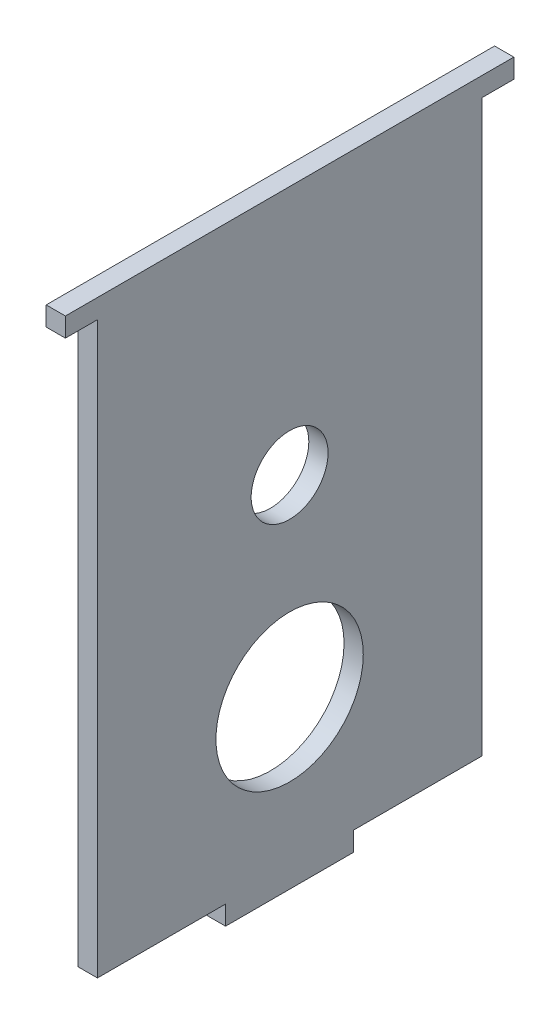
ISO-10303-21;
HEADER;
FILE_DESCRIPTION(('STEP AP214'),'2;1');
FILE_NAME('part.step','',(''),(''),'','','');
FILE_SCHEMA(('AUTOMOTIVE_DESIGN { 1 0 10303 214 1 1 1 1 }'));
ENDSEC;
DATA;
#1=APPLICATION_CONTEXT('core data for automotive mechanical design processes');
#2=APPLICATION_PROTOCOL_DEFINITION('international standard','automotive_design',2000,#1);
#3=PRODUCT_CONTEXT('',#1,'mechanical');
#4=PRODUCT('Part','Part','',(#3));
#5=PRODUCT_RELATED_PRODUCT_CATEGORY('part','',(#4));
#6=PRODUCT_DEFINITION_FORMATION('','',#4);
#7=PRODUCT_DEFINITION_CONTEXT('part definition',#1,'design');
#8=PRODUCT_DEFINITION('design','',#6,#7);
#9=PRODUCT_DEFINITION_SHAPE('','',#8);
#10=(LENGTH_UNIT() NAMED_UNIT(*) SI_UNIT(.MILLI.,.METRE.));
#11=(NAMED_UNIT(*) PLANE_ANGLE_UNIT() SI_UNIT($,.RADIAN.));
#12=(NAMED_UNIT(*) SI_UNIT($,.STERADIAN.) SOLID_ANGLE_UNIT());
#13=UNCERTAINTY_MEASURE_WITH_UNIT(LENGTH_MEASURE(1.E-05),#10,'distance_accuracy_value','');
#14=(GEOMETRIC_REPRESENTATION_CONTEXT(3) GLOBAL_UNCERTAINTY_ASSIGNED_CONTEXT((#13)) GLOBAL_UNIT_ASSIGNED_CONTEXT((#10,
#11,#12)) REPRESENTATION_CONTEXT('',''));
#15=CARTESIAN_POINT('',(0.,0.,0.));
#16=DIRECTION('',(0.,0.,1.));
#17=DIRECTION('',(1.,0.,0.));
#18=AXIS2_PLACEMENT_3D('',#15,#16,#17);
#19=CARTESIAN_POINT('',(3.,-48.,30.));
#20=DIRECTION('',(0.,1.,0.));
#21=DIRECTION('',(0.,0.,1.));
#22=AXIS2_PLACEMENT_3D('',#19,#20,#21);
#23=PLANE('',#22);
#24=DIRECTION('',(-1.,0.,0.));
#25=VECTOR('',#24,1.);
#26=CARTESIAN_POINT('',(3.,-48.,10.));
#27=LINE('',#26,#25);
#28=CARTESIAN_POINT('',(3.,-48.,10.));
#29=VERTEX_POINT('',#28);
#30=CARTESIAN_POINT('',(0.,-48.,10.));
#31=VERTEX_POINT('',#30);
#32=EDGE_CURVE('E136',#29,#31,#27,.T.);
#33=ORIENTED_EDGE('',*,*,#32,.F.);
#34=DIRECTION('',(0.,0.,-1.));
#35=VECTOR('',#34,1.);
#36=CARTESIAN_POINT('',(3.,-48.,30.));
#37=LINE('',#36,#35);
#38=CARTESIAN_POINT('',(3.,-48.,30.));
#39=VERTEX_POINT('',#38);
#40=EDGE_CURVE('E148',#39,#29,#37,.T.);
#41=ORIENTED_EDGE('',*,*,#40,.F.);
#42=DIRECTION('',(-1.,0.,0.));
#43=VECTOR('',#42,1.);
#44=CARTESIAN_POINT('',(3.,-48.,30.));
#45=LINE('',#44,#43);
#46=CARTESIAN_POINT('',(0.,-48.,30.));
#47=VERTEX_POINT('',#46);
#48=EDGE_CURVE('E11',#39,#47,#45,.T.);
#49=ORIENTED_EDGE('',*,*,#48,.T.);
#50=DIRECTION('',(0.,0.,-1.));
#51=VECTOR('',#50,1.);
#52=CARTESIAN_POINT('',(0.,-48.,30.));
#53=LINE('',#52,#51);
#54=EDGE_CURVE('E150',#47,#31,#53,.T.);
#55=ORIENTED_EDGE('',*,*,#54,.T.);
#56=EDGE_LOOP('',(#33,#41,#49,#55));
#57=FACE_BOUND('',#56,.T.);
#58=ADVANCED_FACE('F39',(#57),#23,.F.);
#59=CARTESIAN_POINT('',(3.,48.,-30.));
#60=DIRECTION('',(0.,0.,1.));
#61=DIRECTION('',(0.,-1.,0.));
#62=AXIS2_PLACEMENT_3D('',#59,#60,#61);
#63=PLANE('',#62);
#64=DIRECTION('',(-1.,0.,0.));
#65=VECTOR('',#64,1.);
#66=CARTESIAN_POINT('',(3.,41.,-30.));
#67=LINE('',#66,#65);
#68=CARTESIAN_POINT('',(3.,41.,-30.));
#69=VERTEX_POINT('',#68);
#70=CARTESIAN_POINT('',(0.,41.,-30.));
#71=VERTEX_POINT('',#70);
#72=EDGE_CURVE('E204',#69,#71,#67,.T.);
#73=ORIENTED_EDGE('',*,*,#72,.F.);
#74=DIRECTION('',(0.,1.,0.));
#75=VECTOR('',#74,1.);
#76=CARTESIAN_POINT('',(3.,48.,-30.));
#77=LINE('',#76,#75);
#78=CARTESIAN_POINT('',(3.,-48.,-30.));
#79=VERTEX_POINT('',#78);
#80=EDGE_CURVE('E179',#79,#69,#77,.T.);
#81=ORIENTED_EDGE('',*,*,#80,.F.);
#82=DIRECTION('',(-1.,0.,0.));
#83=VECTOR('',#82,1.);
#84=CARTESIAN_POINT('',(3.,-48.,-30.));
#85=LINE('',#84,#83);
#86=CARTESIAN_POINT('',(0.,-48.,-30.));
#87=VERTEX_POINT('',#86);
#88=EDGE_CURVE('E48',#79,#87,#85,.T.);
#89=ORIENTED_EDGE('',*,*,#88,.T.);
#90=DIRECTION('',(0.,1.,0.));
#91=VECTOR('',#90,1.);
#92=CARTESIAN_POINT('',(0.,48.,-30.));
#93=LINE('',#92,#91);
#94=EDGE_CURVE('E169',#87,#71,#93,.T.);
#95=ORIENTED_EDGE('',*,*,#94,.T.);
#96=EDGE_LOOP('',(#73,#81,#89,#95));
#97=FACE_BOUND('',#96,.T.);
#98=ADVANCED_FACE('F41',(#97),#63,.F.);
#99=CARTESIAN_POINT('',(3.,48.,30.));
#100=DIRECTION('',(0.,0.,-1.));
#101=DIRECTION('',(0.,1.,0.));
#102=AXIS2_PLACEMENT_3D('',#99,#100,#101);
#103=PLANE('',#102);
#104=DIRECTION('',(0.,-1.,0.));
#105=VECTOR('',#104,1.);
#106=CARTESIAN_POINT('',(3.,48.,30.));
#107=LINE('',#106,#105);
#108=CARTESIAN_POINT('',(3.,41.,30.));
#109=VERTEX_POINT('',#108);
#110=EDGE_CURVE('E158',#109,#39,#107,.T.);
#111=ORIENTED_EDGE('',*,*,#110,.F.);
#112=DIRECTION('',(-1.,0.,0.));
#113=VECTOR('',#112,1.);
#114=CARTESIAN_POINT('',(3.,41.,30.));
#115=LINE('',#114,#113);
#116=CARTESIAN_POINT('',(0.,41.,30.));
#117=VERTEX_POINT('',#116);
#118=EDGE_CURVE('E227',#109,#117,#115,.T.);
#119=ORIENTED_EDGE('',*,*,#118,.T.);
#120=DIRECTION('',(0.,-1.,0.));
#121=VECTOR('',#120,1.);
#122=CARTESIAN_POINT('',(0.,48.,30.));
#123=LINE('',#122,#121);
#124=EDGE_CURVE('E173',#117,#47,#123,.T.);
#125=ORIENTED_EDGE('',*,*,#124,.T.);
#126=ORIENTED_EDGE('',*,*,#48,.F.);
#127=EDGE_LOOP('',(#111,#119,#125,#126));
#128=FACE_BOUND('',#127,.T.);
#129=ADVANCED_FACE('F268',(#128),#103,.F.);
#130=CARTESIAN_POINT('',(3.,-48.,-10.));
#131=VERTEX_POINT('',#130);
#132=EDGE_CURVE('E161',#131,#79,#37,.T.);
#133=ORIENTED_EDGE('',*,*,#132,.F.);
#134=DIRECTION('',(-1.,0.,0.));
#135=VECTOR('',#134,1.);
#136=CARTESIAN_POINT('',(3.,-48.,-10.));
#137=LINE('',#136,#135);
#138=CARTESIAN_POINT('',(0.,-48.,-10.));
#139=VERTEX_POINT('',#138);
#140=EDGE_CURVE('E189',#131,#139,#137,.T.);
#141=ORIENTED_EDGE('',*,*,#140,.T.);
#142=EDGE_CURVE('E177',#139,#87,#53,.T.);
#143=ORIENTED_EDGE('',*,*,#142,.T.);
#144=ORIENTED_EDGE('',*,*,#88,.F.);
#145=EDGE_LOOP('',(#133,#141,#143,#144));
#146=FACE_BOUND('',#145,.T.);
#147=ADVANCED_FACE('F187',(#146),#23,.F.);
#148=CARTESIAN_POINT('',(3.,0.,0.));
#149=DIRECTION('',(1.,0.,0.));
#150=DIRECTION('',(0.,0.,-1.));
#151=AXIS2_PLACEMENT_3D('',#148,#149,#150);
#152=PLANE('',#151);
#153=DIRECTION('',(0.,1.,0.));
#154=VECTOR('',#153,1.);
#155=CARTESIAN_POINT('',(3.,41.,-35.));
#156=LINE('',#155,#154);
#157=CARTESIAN_POINT('',(3.,41.,-35.));
#158=VERTEX_POINT('',#157);
#159=CARTESIAN_POINT('',(3.,44.,-35.));
#160=VERTEX_POINT('',#159);
#161=EDGE_CURVE('E303',#158,#160,#156,.T.);
#162=ORIENTED_EDGE('',*,*,#161,.T.);
#163=DIRECTION('',(0.,0.,1.));
#164=VECTOR('',#163,1.);
#165=CARTESIAN_POINT('',(3.,44.,35.));
#166=LINE('',#165,#164);
#167=CARTESIAN_POINT('',(3.,44.,35.));
#168=VERTEX_POINT('',#167);
#169=EDGE_CURVE('E219',#160,#168,#166,.T.);
#170=ORIENTED_EDGE('',*,*,#169,.T.);
#171=DIRECTION('',(0.,-1.,0.));
#172=VECTOR('',#171,1.);
#173=CARTESIAN_POINT('',(3.,41.,35.));
#174=LINE('',#173,#172);
#175=CARTESIAN_POINT('',(3.,41.,35.));
#176=VERTEX_POINT('',#175);
#177=EDGE_CURVE('E222',#168,#176,#174,.T.);
#178=ORIENTED_EDGE('',*,*,#177,.T.);
#179=DIRECTION('',(0.,0.,-1.));
#180=VECTOR('',#179,1.);
#181=CARTESIAN_POINT('',(3.,41.,30.));
#182=LINE('',#181,#180);
#183=EDGE_CURVE('E225',#176,#109,#182,.T.);
#184=ORIENTED_EDGE('',*,*,#183,.T.);
#185=ORIENTED_EDGE('',*,*,#110,.T.);
#186=ORIENTED_EDGE('',*,*,#40,.T.);
#187=DIRECTION('',(0.,-1.,0.));
#188=VECTOR('',#187,1.);
#189=CARTESIAN_POINT('',(3.,-48.,10.));
#190=LINE('',#189,#188);
#191=CARTESIAN_POINT('',(3.,-51.,10.));
#192=VERTEX_POINT('',#191);
#193=EDGE_CURVE('E133',#29,#192,#190,.T.);
#194=ORIENTED_EDGE('',*,*,#193,.T.);
#195=DIRECTION('',(0.,0.,-1.));
#196=VECTOR('',#195,1.);
#197=CARTESIAN_POINT('',(3.,-51.,10.));
#198=LINE('',#197,#196);
#199=CARTESIAN_POINT('',(3.,-51.,-10.));
#200=VERTEX_POINT('',#199);
#201=EDGE_CURVE('E144',#192,#200,#198,.T.);
#202=ORIENTED_EDGE('',*,*,#201,.T.);
#203=DIRECTION('',(0.,1.,0.));
#204=VECTOR('',#203,1.);
#205=CARTESIAN_POINT('',(3.,-51.,-10.));
#206=LINE('',#205,#204);
#207=EDGE_CURVE('E289',#200,#131,#206,.T.);
#208=ORIENTED_EDGE('',*,*,#207,.T.);
#209=ORIENTED_EDGE('',*,*,#132,.T.);
#210=ORIENTED_EDGE('',*,*,#80,.T.);
#211=DIRECTION('',(0.,0.,-1.));
#212=VECTOR('',#211,1.);
#213=CARTESIAN_POINT('',(3.,41.,-30.));
#214=LINE('',#213,#212);
#215=EDGE_CURVE('E206',#69,#158,#214,.T.);
#216=ORIENTED_EDGE('',*,*,#215,.T.);
#217=EDGE_LOOP('',(#162,#170,#178,#184,#185,#186,#194,#202,#208,#209,#210,#216));
#218=FACE_BOUND('',#217,.T.);
#219=CARTESIAN_POINT('',(3.,-25.,0.));
#220=DIRECTION('',(1.,0.,0.));
#221=DIRECTION('',(0.,0.,-1.));
#222=AXIS2_PLACEMENT_3D('',#219,#220,#221);
#223=CIRCLE('',#222,11.5);
#224=CARTESIAN_POINT('',(3.,-25.,-11.5));
#225=VERTEX_POINT('',#224);
#226=EDGE_CURVE('E246',#225,#225,#223,.T.);
#227=ORIENTED_EDGE('',*,*,#226,.F.);
#228=EDGE_LOOP('',(#227));
#229=FACE_BOUND('',#228,.T.);
#230=CARTESIAN_POINT('',(3.,5.,0.));
#231=DIRECTION('',(1.,0.,0.));
#232=DIRECTION('',(0.,0.,-1.));
#233=AXIS2_PLACEMENT_3D('',#230,#231,#232);
#234=CIRCLE('',#233,6.);
#235=CARTESIAN_POINT('',(3.,5.,-6.));
#236=VERTEX_POINT('',#235);
#237=EDGE_CURVE('E242',#236,#236,#234,.T.);
#238=ORIENTED_EDGE('',*,*,#237,.F.);
#239=EDGE_LOOP('',(#238));
#240=FACE_BOUND('',#239,.T.);
#241=ADVANCED_FACE('F155',(#218,#229,#240),#152,.T.);
#242=CARTESIAN_POINT('',(0.,0.,0.));
#243=DIRECTION('',(1.,0.,0.));
#244=DIRECTION('',(0.,0.,-1.));
#245=AXIS2_PLACEMENT_3D('',#242,#243,#244);
#246=PLANE('',#245);
#247=CARTESIAN_POINT('',(0.,-25.,0.));
#248=DIRECTION('',(1.,0.,0.));
#249=DIRECTION('',(0.,0.,-1.));
#250=AXIS2_PLACEMENT_3D('',#247,#248,#249);
#251=CIRCLE('',#250,11.5);
#252=CARTESIAN_POINT('',(0.,-25.,-11.5));
#253=VERTEX_POINT('',#252);
#254=EDGE_CURVE('E174',#253,#253,#251,.T.);
#255=ORIENTED_EDGE('',*,*,#254,.T.);
#256=EDGE_LOOP('',(#255));
#257=FACE_BOUND('',#256,.T.);
#258=CARTESIAN_POINT('',(0.,5.,0.));
#259=DIRECTION('',(1.,0.,0.));
#260=DIRECTION('',(0.,0.,-1.));
#261=AXIS2_PLACEMENT_3D('',#258,#259,#260);
#262=CIRCLE('',#261,6.);
#263=CARTESIAN_POINT('',(0.,5.,-6.));
#264=VERTEX_POINT('',#263);
#265=EDGE_CURVE('E250',#264,#264,#262,.T.);
#266=ORIENTED_EDGE('',*,*,#265,.T.);
#267=EDGE_LOOP('',(#266));
#268=FACE_BOUND('',#267,.T.);
#269=DIRECTION('',(0.,0.,1.));
#270=VECTOR('',#269,1.);
#271=CARTESIAN_POINT('',(0.,44.,35.));
#272=LINE('',#271,#270);
#273=CARTESIAN_POINT('',(0.,44.,-35.));
#274=VERTEX_POINT('',#273);
#275=CARTESIAN_POINT('',(0.,44.,35.));
#276=VERTEX_POINT('',#275);
#277=EDGE_CURVE('E208',#274,#276,#272,.T.);
#278=ORIENTED_EDGE('',*,*,#277,.F.);
#279=DIRECTION('',(0.,1.,0.));
#280=VECTOR('',#279,1.);
#281=CARTESIAN_POINT('',(0.,41.,-35.));
#282=LINE('',#281,#280);
#283=CARTESIAN_POINT('',(0.,41.,-35.));
#284=VERTEX_POINT('',#283);
#285=EDGE_CURVE('E198',#284,#274,#282,.T.);
#286=ORIENTED_EDGE('',*,*,#285,.F.);
#287=DIRECTION('',(0.,0.,-1.));
#288=VECTOR('',#287,1.);
#289=CARTESIAN_POINT('',(0.,41.,-30.));
#290=LINE('',#289,#288);
#291=EDGE_CURVE('E152',#71,#284,#290,.T.);
#292=ORIENTED_EDGE('',*,*,#291,.F.);
#293=ORIENTED_EDGE('',*,*,#94,.F.);
#294=ORIENTED_EDGE('',*,*,#142,.F.);
#295=DIRECTION('',(0.,1.,0.));
#296=VECTOR('',#295,1.);
#297=CARTESIAN_POINT('',(0.,-51.,-10.));
#298=LINE('',#297,#296);
#299=CARTESIAN_POINT('',(0.,-51.,-10.));
#300=VERTEX_POINT('',#299);
#301=EDGE_CURVE('E55',#300,#139,#298,.T.);
#302=ORIENTED_EDGE('',*,*,#301,.F.);
#303=DIRECTION('',(0.,0.,-1.));
#304=VECTOR('',#303,1.);
#305=CARTESIAN_POINT('',(0.,-51.,10.));
#306=LINE('',#305,#304);
#307=CARTESIAN_POINT('',(0.,-51.,10.));
#308=VERTEX_POINT('',#307);
#309=EDGE_CURVE('E283',#308,#300,#306,.T.);
#310=ORIENTED_EDGE('',*,*,#309,.F.);
#311=DIRECTION('',(0.,-1.,0.));
#312=VECTOR('',#311,1.);
#313=CARTESIAN_POINT('',(0.,-48.,10.));
#314=LINE('',#313,#312);
#315=EDGE_CURVE('E282',#31,#308,#314,.T.);
#316=ORIENTED_EDGE('',*,*,#315,.F.);
#317=ORIENTED_EDGE('',*,*,#54,.F.);
#318=ORIENTED_EDGE('',*,*,#124,.F.);
#319=DIRECTION('',(0.,0.,-1.));
#320=VECTOR('',#319,1.);
#321=CARTESIAN_POINT('',(0.,41.,30.));
#322=LINE('',#321,#320);
#323=CARTESIAN_POINT('',(0.,41.,35.));
#324=VERTEX_POINT('',#323);
#325=EDGE_CURVE('E63',#324,#117,#322,.T.);
#326=ORIENTED_EDGE('',*,*,#325,.F.);
#327=DIRECTION('',(0.,-1.,0.));
#328=VECTOR('',#327,1.);
#329=CARTESIAN_POINT('',(0.,41.,35.));
#330=LINE('',#329,#328);
#331=EDGE_CURVE('E213',#276,#324,#330,.T.);
#332=ORIENTED_EDGE('',*,*,#331,.F.);
#333=EDGE_LOOP('',(#278,#286,#292,#293,#294,#302,#310,#316,#317,#318,#326,#332));
#334=FACE_BOUND('',#333,.T.);
#335=ADVANCED_FACE('F194',(#257,#268,#334),#246,.F.);
#336=CARTESIAN_POINT('',(0.,5.,0.));
#337=DIRECTION('',(1.,0.,0.));
#338=DIRECTION('',(0.,0.,-1.));
#339=AXIS2_PLACEMENT_3D('',#336,#337,#338);
#340=CYLINDRICAL_SURFACE('',#339,6.);
#341=ORIENTED_EDGE('',*,*,#265,.F.);
#342=EDGE_LOOP('',(#341));
#343=FACE_BOUND('',#342,.T.);
#344=ORIENTED_EDGE('',*,*,#237,.T.);
#345=EDGE_LOOP('',(#344));
#346=FACE_BOUND('',#345,.T.);
#347=ADVANCED_FACE('F258',(#343,#346),#340,.F.);
#348=CARTESIAN_POINT('',(0.,-25.,0.));
#349=DIRECTION('',(1.,0.,0.));
#350=DIRECTION('',(0.,0.,-1.));
#351=AXIS2_PLACEMENT_3D('',#348,#349,#350);
#352=CYLINDRICAL_SURFACE('',#351,11.5);
#353=ORIENTED_EDGE('',*,*,#254,.F.);
#354=EDGE_LOOP('',(#353));
#355=FACE_BOUND('',#354,.T.);
#356=ORIENTED_EDGE('',*,*,#226,.T.);
#357=EDGE_LOOP('',(#356));
#358=FACE_BOUND('',#357,.T.);
#359=ADVANCED_FACE('F344',(#355,#358),#352,.F.);
#360=CARTESIAN_POINT('',(3.,44.,35.));
#361=DIRECTION('',(0.,-1.,0.));
#362=DIRECTION('',(0.,0.,-1.));
#363=AXIS2_PLACEMENT_3D('',#360,#361,#362);
#364=PLANE('',#363);
#365=ORIENTED_EDGE('',*,*,#277,.T.);
#366=DIRECTION('',(-1.,0.,0.));
#367=VECTOR('',#366,1.);
#368=CARTESIAN_POINT('',(3.,44.,35.));
#369=LINE('',#368,#367);
#370=EDGE_CURVE('E238',#168,#276,#369,.T.);
#371=ORIENTED_EDGE('',*,*,#370,.F.);
#372=ORIENTED_EDGE('',*,*,#169,.F.);
#373=DIRECTION('',(-1.,0.,0.));
#374=VECTOR('',#373,1.);
#375=CARTESIAN_POINT('',(3.,44.,-35.));
#376=LINE('',#375,#374);
#377=EDGE_CURVE('E215',#160,#274,#376,.T.);
#378=ORIENTED_EDGE('',*,*,#377,.T.);
#379=EDGE_LOOP('',(#365,#371,#372,#378));
#380=FACE_BOUND('',#379,.T.);
#381=ADVANCED_FACE('F311',(#380),#364,.F.);
#382=CARTESIAN_POINT('',(3.,41.,35.));
#383=DIRECTION('',(0.,0.,-1.));
#384=DIRECTION('',(-1.,0.,0.));
#385=AXIS2_PLACEMENT_3D('',#382,#383,#384);
#386=PLANE('',#385);
#387=ORIENTED_EDGE('',*,*,#331,.T.);
#388=DIRECTION('',(-1.,0.,0.));
#389=VECTOR('',#388,1.);
#390=CARTESIAN_POINT('',(3.,41.,35.));
#391=LINE('',#390,#389);
#392=EDGE_CURVE('E235',#176,#324,#391,.T.);
#393=ORIENTED_EDGE('',*,*,#392,.F.);
#394=ORIENTED_EDGE('',*,*,#177,.F.);
#395=ORIENTED_EDGE('',*,*,#370,.T.);
#396=EDGE_LOOP('',(#387,#393,#394,#395));
#397=FACE_BOUND('',#396,.T.);
#398=ADVANCED_FACE('F338',(#397),#386,.F.);
#399=CARTESIAN_POINT('',(3.,41.,30.));
#400=DIRECTION('',(0.,1.,0.));
#401=DIRECTION('',(0.,0.,1.));
#402=AXIS2_PLACEMENT_3D('',#399,#400,#401);
#403=PLANE('',#402);
#404=ORIENTED_EDGE('',*,*,#325,.T.);
#405=ORIENTED_EDGE('',*,*,#118,.F.);
#406=ORIENTED_EDGE('',*,*,#183,.F.);
#407=ORIENTED_EDGE('',*,*,#392,.T.);
#408=EDGE_LOOP('',(#404,#405,#406,#407));
#409=FACE_BOUND('',#408,.T.);
#410=ADVANCED_FACE('F335',(#409),#403,.F.);
#411=CARTESIAN_POINT('',(3.,41.,-30.));
#412=DIRECTION('',(0.,1.,0.));
#413=DIRECTION('',(0.,0.,1.));
#414=AXIS2_PLACEMENT_3D('',#411,#412,#413);
#415=PLANE('',#414);
#416=ORIENTED_EDGE('',*,*,#291,.T.);
#417=DIRECTION('',(-1.,0.,0.));
#418=VECTOR('',#417,1.);
#419=CARTESIAN_POINT('',(3.,41.,-35.));
#420=LINE('',#419,#418);
#421=EDGE_CURVE('E209',#158,#284,#420,.T.);
#422=ORIENTED_EDGE('',*,*,#421,.F.);
#423=ORIENTED_EDGE('',*,*,#215,.F.);
#424=ORIENTED_EDGE('',*,*,#72,.T.);
#425=EDGE_LOOP('',(#416,#422,#423,#424));
#426=FACE_BOUND('',#425,.T.);
#427=ADVANCED_FACE('F205',(#426),#415,.F.);
#428=CARTESIAN_POINT('',(3.,41.,-35.));
#429=DIRECTION('',(0.,0.,1.));
#430=DIRECTION('',(1.,0.,0.));
#431=AXIS2_PLACEMENT_3D('',#428,#429,#430);
#432=PLANE('',#431);
#433=ORIENTED_EDGE('',*,*,#285,.T.);
#434=ORIENTED_EDGE('',*,*,#377,.F.);
#435=ORIENTED_EDGE('',*,*,#161,.F.);
#436=ORIENTED_EDGE('',*,*,#421,.T.);
#437=EDGE_LOOP('',(#433,#434,#435,#436));
#438=FACE_BOUND('',#437,.T.);
#439=ADVANCED_FACE('F315',(#438),#432,.F.);
#440=CARTESIAN_POINT('',(3.,-48.,10.));
#441=DIRECTION('',(0.,0.,-1.));
#442=DIRECTION('',(-1.,0.,0.));
#443=AXIS2_PLACEMENT_3D('',#440,#441,#442);
#444=PLANE('',#443);
#445=ORIENTED_EDGE('',*,*,#315,.T.);
#446=DIRECTION('',(-1.,0.,0.));
#447=VECTOR('',#446,1.);
#448=CARTESIAN_POINT('',(3.,-51.,10.));
#449=LINE('',#448,#447);
#450=EDGE_CURVE('E139',#192,#308,#449,.T.);
#451=ORIENTED_EDGE('',*,*,#450,.F.);
#452=ORIENTED_EDGE('',*,*,#193,.F.);
#453=ORIENTED_EDGE('',*,*,#32,.T.);
#454=EDGE_LOOP('',(#445,#451,#452,#453));
#455=FACE_BOUND('',#454,.T.);
#456=ADVANCED_FACE('F135',(#455),#444,.F.);
#457=CARTESIAN_POINT('',(3.,-51.,10.));
#458=DIRECTION('',(0.,1.,0.));
#459=DIRECTION('',(0.,0.,1.));
#460=AXIS2_PLACEMENT_3D('',#457,#458,#459);
#461=PLANE('',#460);
#462=ORIENTED_EDGE('',*,*,#309,.T.);
#463=DIRECTION('',(-1.,0.,0.));
#464=VECTOR('',#463,1.);
#465=CARTESIAN_POINT('',(3.,-51.,-10.));
#466=LINE('',#465,#464);
#467=EDGE_CURVE('E296',#200,#300,#466,.T.);
#468=ORIENTED_EDGE('',*,*,#467,.F.);
#469=ORIENTED_EDGE('',*,*,#201,.F.);
#470=ORIENTED_EDGE('',*,*,#450,.T.);
#471=EDGE_LOOP('',(#462,#468,#469,#470));
#472=FACE_BOUND('',#471,.T.);
#473=ADVANCED_FACE('F321',(#472),#461,.F.);
#474=CARTESIAN_POINT('',(3.,-51.,-10.));
#475=DIRECTION('',(0.,0.,1.));
#476=DIRECTION('',(0.,-1.,0.));
#477=AXIS2_PLACEMENT_3D('',#474,#475,#476);
#478=PLANE('',#477);
#479=ORIENTED_EDGE('',*,*,#301,.T.);
#480=ORIENTED_EDGE('',*,*,#140,.F.);
#481=ORIENTED_EDGE('',*,*,#207,.F.);
#482=ORIENTED_EDGE('',*,*,#467,.T.);
#483=EDGE_LOOP('',(#479,#480,#481,#482));
#484=FACE_BOUND('',#483,.T.);
#485=ADVANCED_FACE('F319',(#484),#478,.F.);
#486=CLOSED_SHELL('',(#58,#98,#129,#147,#241,#335,#347,#359,#381,#398,#410,#427,#439,#456,#473,#485));
#487=MANIFOLD_SOLID_BREP('B2',#486);
#488=ADVANCED_BREP_SHAPE_REPRESENTATION('',(#18,#487),#14);
#489=SHAPE_DEFINITION_REPRESENTATION(#9,#488);
ENDSEC;
END-ISO-10303-21;
